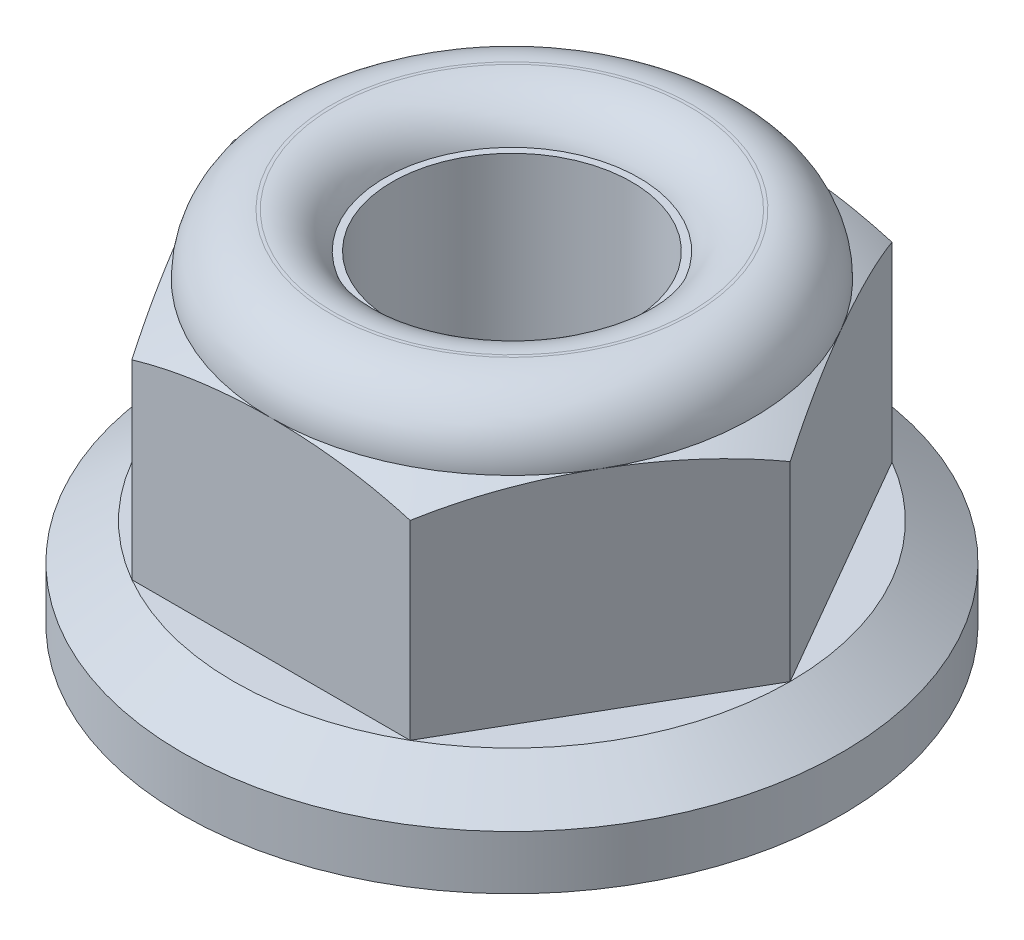
ISO-10303-21;
HEADER;
FILE_DESCRIPTION(('STEP AP214'),'2;1');
FILE_NAME('part.step','',(''),(''),'','','');
FILE_SCHEMA(('AUTOMOTIVE_DESIGN { 1 0 10303 214 1 1 1 1 }'));
ENDSEC;
DATA;
#1=APPLICATION_CONTEXT('core data for automotive mechanical design processes');
#2=APPLICATION_PROTOCOL_DEFINITION('international standard','automotive_design',2000,#1);
#3=PRODUCT_CONTEXT('',#1,'mechanical');
#4=PRODUCT('Part','Part','',(#3));
#5=PRODUCT_RELATED_PRODUCT_CATEGORY('part','',(#4));
#6=PRODUCT_DEFINITION_FORMATION('','',#4);
#7=PRODUCT_DEFINITION_CONTEXT('part definition',#1,'design');
#8=PRODUCT_DEFINITION('design','',#6,#7);
#9=PRODUCT_DEFINITION_SHAPE('','',#8);
#10=(LENGTH_UNIT() NAMED_UNIT(*) SI_UNIT(.MILLI.,.METRE.));
#11=(NAMED_UNIT(*) PLANE_ANGLE_UNIT() SI_UNIT($,.RADIAN.));
#12=(NAMED_UNIT(*) SI_UNIT($,.STERADIAN.) SOLID_ANGLE_UNIT());
#13=UNCERTAINTY_MEASURE_WITH_UNIT(LENGTH_MEASURE(1.E-05),#10,'distance_accuracy_value','');
#14=(GEOMETRIC_REPRESENTATION_CONTEXT(3) GLOBAL_UNCERTAINTY_ASSIGNED_CONTEXT((#13)) GLOBAL_UNIT_ASSIGNED_CONTEXT((#10,
#11,#12)) REPRESENTATION_CONTEXT('',''));
#15=CARTESIAN_POINT('',(0.,0.,0.));
#16=DIRECTION('',(0.,0.,1.));
#17=DIRECTION('',(1.,0.,0.));
#18=AXIS2_PLACEMENT_3D('',#15,#16,#17);
#19=CARTESIAN_POINT('',(0.,1.5,0.));
#20=DIRECTION('',(0.,1.,0.));
#21=DIRECTION('',(0.,0.,1.));
#22=AXIS2_PLACEMENT_3D('',#19,#20,#21);
#23=PLANE('',#22);
#24=DIRECTION('',(0.499999999999995,0.,-0.866025403784441));
#25=VECTOR('',#24,1.);
#26=CARTESIAN_POINT('',(2.32155559797741,1.5,4.02105224829271));
#27=LINE('',#26,#25);
#28=CARTESIAN_POINT('',(2.32155559797741,1.5,4.02105224829271));
#29=VERTEX_POINT('',#28);
#30=CARTESIAN_POINT('',(4.64311119595473,1.5,0.));
#31=VERTEX_POINT('',#30);
#32=EDGE_CURVE('E154',#29,#31,#27,.T.);
#33=ORIENTED_EDGE('',*,*,#32,.F.);
#34=CARTESIAN_POINT('',(0.,1.5,0.));
#35=DIRECTION('',(0.,1.,0.));
#36=DIRECTION('',(0.,0.,1.));
#37=AXIS2_PLACEMENT_3D('',#34,#35,#36);
#38=CIRCLE('',#37,4.64311119595473);
#39=EDGE_CURVE('E310',#29,#31,#38,.T.);
#40=ORIENTED_EDGE('',*,*,#39,.T.);
#41=EDGE_LOOP('',(#33,#40));
#42=FACE_BOUND('',#41,.T.);
#43=ADVANCED_FACE('F41',(#42),#23,.T.);
#44=DIRECTION('',(1.,0.,0.));
#45=VECTOR('',#44,1.);
#46=CARTESIAN_POINT('',(-2.32155559797733,1.5,4.02105224829276));
#47=LINE('',#46,#45);
#48=CARTESIAN_POINT('',(-2.32155559797733,1.5,4.02105224829276));
#49=VERTEX_POINT('',#48);
#50=EDGE_CURVE('E288',#49,#29,#47,.T.);
#51=ORIENTED_EDGE('',*,*,#50,.F.);
#52=EDGE_CURVE('E309',#49,#29,#38,.T.);
#53=ORIENTED_EDGE('',*,*,#52,.T.);
#54=EDGE_LOOP('',(#51,#53));
#55=FACE_BOUND('',#54,.T.);
#56=ADVANCED_FACE('F230',(#55),#23,.T.);
#57=DIRECTION('',(0.500000000000007,0.,0.866025403784435));
#58=VECTOR('',#57,1.);
#59=CARTESIAN_POINT('',(-4.64311119595473,1.5,0.));
#60=LINE('',#59,#58);
#61=CARTESIAN_POINT('',(-4.64311119595473,1.5,0.));
#62=VERTEX_POINT('',#61);
#63=EDGE_CURVE('E284',#62,#49,#60,.T.);
#64=ORIENTED_EDGE('',*,*,#63,.F.);
#65=EDGE_CURVE('E330',#62,#49,#38,.T.);
#66=ORIENTED_EDGE('',*,*,#65,.T.);
#67=EDGE_LOOP('',(#64,#66));
#68=FACE_BOUND('',#67,.T.);
#69=ADVANCED_FACE('F237',(#68),#23,.T.);
#70=DIRECTION('',(-0.499999999999995,0.,0.866025403784442));
#71=VECTOR('',#70,1.);
#72=CARTESIAN_POINT('',(-2.32155559797738,1.5,-4.02105224829273));
#73=LINE('',#72,#71);
#74=CARTESIAN_POINT('',(-2.32155559797738,1.5,-4.02105224829273));
#75=VERTEX_POINT('',#74);
#76=EDGE_CURVE('E269',#75,#62,#73,.T.);
#77=ORIENTED_EDGE('',*,*,#76,.F.);
#78=EDGE_CURVE('E332',#75,#62,#38,.T.);
#79=ORIENTED_EDGE('',*,*,#78,.T.);
#80=EDGE_LOOP('',(#77,#79));
#81=FACE_BOUND('',#80,.T.);
#82=ADVANCED_FACE('F256',(#81),#23,.T.);
#83=DIRECTION('',(-1.,0.,0.));
#84=VECTOR('',#83,1.);
#85=CARTESIAN_POINT('',(2.32155559797736,1.5,-4.02105224829275));
#86=LINE('',#85,#84);
#87=CARTESIAN_POINT('',(2.32155559797736,1.5,-4.02105224829275));
#88=VERTEX_POINT('',#87);
#89=EDGE_CURVE('E264',#88,#75,#86,.T.);
#90=ORIENTED_EDGE('',*,*,#89,.F.);
#91=EDGE_CURVE('E267',#88,#75,#38,.T.);
#92=ORIENTED_EDGE('',*,*,#91,.T.);
#93=EDGE_LOOP('',(#90,#92));
#94=FACE_BOUND('',#93,.T.);
#95=ADVANCED_FACE('F245',(#94),#23,.T.);
#96=CARTESIAN_POINT('',(0.,1.5,0.));
#97=DIRECTION('',(0.,-1.,0.));
#98=DIRECTION('',(0.,0.,-1.));
#99=AXIS2_PLACEMENT_3D('',#96,#97,#98);
#100=CYLINDRICAL_SURFACE('',#99,5.5);
#101=CARTESIAN_POINT('',(0.,0.899999999999997,0.));
#102=DIRECTION('',(0.,1.,0.));
#103=DIRECTION('',(0.,0.,1.));
#104=AXIS2_PLACEMENT_3D('',#101,#102,#103);
#105=CIRCLE('',#104,5.5);
#106=CARTESIAN_POINT('',(0.,0.899999999999997,5.5));
#107=VERTEX_POINT('',#106);
#108=EDGE_CURVE('E51',#107,#107,#105,.F.);
#109=ORIENTED_EDGE('',*,*,#108,.T.);
#110=EDGE_LOOP('',(#109));
#111=FACE_BOUND('',#110,.T.);
#112=CARTESIAN_POINT('',(0.,0.,0.));
#113=DIRECTION('',(0.,1.,0.));
#114=DIRECTION('',(0.,0.,1.));
#115=AXIS2_PLACEMENT_3D('',#112,#113,#114);
#116=CIRCLE('',#115,5.5);
#117=CARTESIAN_POINT('',(0.,0.,5.5));
#118=VERTEX_POINT('',#117);
#119=EDGE_CURVE('E305',#118,#118,#116,.T.);
#120=ORIENTED_EDGE('',*,*,#119,.T.);
#121=EDGE_LOOP('',(#120));
#122=FACE_BOUND('',#121,.T.);
#123=ADVANCED_FACE('F243',(#111,#122),#100,.T.);
#124=DIRECTION('',(-0.500000000000001,0.,-0.866025403784438));
#125=VECTOR('',#124,1.);
#126=CARTESIAN_POINT('',(4.64311119595473,1.5,0.));
#127=LINE('',#126,#125);
#128=EDGE_CURVE('E157',#31,#88,#127,.T.);
#129=ORIENTED_EDGE('',*,*,#128,.F.);
#130=EDGE_CURVE('E314',#31,#88,#38,.T.);
#131=ORIENTED_EDGE('',*,*,#130,.T.);
#132=EDGE_LOOP('',(#129,#131));
#133=FACE_BOUND('',#132,.T.);
#134=ADVANCED_FACE('F233',(#133),#23,.T.);
#135=CARTESIAN_POINT('',(0.,0.,0.));
#136=DIRECTION('',(0.,1.,0.));
#137=DIRECTION('',(0.,0.,1.));
#138=AXIS2_PLACEMENT_3D('',#135,#136,#137);
#139=PLANE('',#138);
#140=CARTESIAN_POINT('',(0.,0.,0.));
#141=DIRECTION('',(0.,1.,0.));
#142=DIRECTION('',(0.,0.,1.));
#143=AXIS2_PLACEMENT_3D('',#140,#141,#142);
#144=CIRCLE('',#143,2.);
#145=CARTESIAN_POINT('',(0.,0.,2.));
#146=VERTEX_POINT('',#145);
#147=EDGE_CURVE('E375',#146,#146,#144,.T.);
#148=ORIENTED_EDGE('',*,*,#147,.T.);
#149=EDGE_LOOP('',(#148));
#150=FACE_BOUND('',#149,.T.);
#151=ORIENTED_EDGE('',*,*,#119,.F.);
#152=EDGE_LOOP('',(#151));
#153=FACE_BOUND('',#152,.T.);
#154=ADVANCED_FACE('F242',(#150,#153),#139,.F.);
#155=CARTESIAN_POINT('',(0.,1.5,0.));
#156=DIRECTION('',(0.,-1.,0.));
#157=DIRECTION('',(0.,0.,-1.));
#158=AXIS2_PLACEMENT_3D('',#155,#156,#157);
#159=CONICAL_SURFACE('',#158,4.64311119595473,0.959931088596881);
#160=ORIENTED_EDGE('',*,*,#108,.F.);
#161=EDGE_LOOP('',(#160));
#162=FACE_BOUND('',#161,.T.);
#163=ORIENTED_EDGE('',*,*,#39,.F.);
#164=ORIENTED_EDGE('',*,*,#52,.F.);
#165=ORIENTED_EDGE('',*,*,#65,.F.);
#166=ORIENTED_EDGE('',*,*,#78,.F.);
#167=ORIENTED_EDGE('',*,*,#91,.F.);
#168=ORIENTED_EDGE('',*,*,#130,.F.);
#169=EDGE_LOOP('',(#163,#164,#165,#166,#167,#168));
#170=FACE_BOUND('',#169,.T.);
#171=ADVANCED_FACE('F250',(#162,#170),#159,.T.);
#172=CARTESIAN_POINT('',(2.32155559797741,5.,4.02105224829271));
#173=DIRECTION('',(-0.866025403784441,0.,-0.499999999999995));
#174=DIRECTION('',(-0.499999999999995,0.,0.866025403784442));
#175=AXIS2_PLACEMENT_3D('',#172,#173,#174);
#176=PLANE('',#175);
#177=DIRECTION('',(0.,-1.,0.));
#178=VECTOR('',#177,1.);
#179=CARTESIAN_POINT('',(4.64311119595473,5.,0.));
#180=LINE('',#179,#178);
#181=CARTESIAN_POINT('',(4.64311119594153,4.67908661968016,2.28647358120848E-11));
#182=VERTEX_POINT('',#181);
#183=EDGE_CURVE('E276',#182,#31,#180,.T.);
#184=ORIENTED_EDGE('',*,*,#183,.F.);
#185=CARTESIAN_POINT('',(4.64322666600857,4.6790184883887,-0.0002));
#186=CARTESIAN_POINT('',(4.54071917949174,4.73949251452338,0.177348174803329));
#187=CARTESIAN_POINT('',(4.43692175263319,4.79074061593738,0.357130591817245));
#188=CARTESIAN_POINT('',(4.22765773875299,4.8759125553234,0.719586496053555));
#189=CARTESIAN_POINT('',(4.12219283652897,4.90985285509736,0.902257065120857));
#190=CARTESIAN_POINT('',(3.91240969791152,4.96113335951711,1.26561211977754));
#191=CARTESIAN_POINT('',(3.80811027238886,4.97878978628818,1.44626402398305));
#192=CARTESIAN_POINT('',(3.59911651271135,4.99942589079987,1.80825183420933));
#193=CARTESIAN_POINT('',(3.49442206382298,5.00240091296633,1.98958793895442));
#194=CARTESIAN_POINT('',(3.30030949241052,4.99442047579395,2.32580077502864));
#195=CARTESIAN_POINT('',(3.21087010838088,4.98541595773325,2.48071433236565));
#196=CARTESIAN_POINT('',(3.03247101960875,4.95644886890957,2.78971061814296));
#197=CARTESIAN_POINT('',(2.94351111441542,4.93649130556302,2.94379369377433));
#198=CARTESIAN_POINT('',(2.76488470912722,4.88459340553708,3.25318370330689));
#199=CARTESIAN_POINT('',(2.67523258919098,4.85245183791246,3.40846573004272));
#200=CARTESIAN_POINT('',(2.49721570619962,4.77545954599915,3.7168000159888));
#201=CARTESIAN_POINT('',(2.40885230998724,4.73059623238281,3.86984990775798));
#202=CARTESIAN_POINT('',(2.32144012792357,4.6790184883887,4.02125224829271));
#203=B_SPLINE_CURVE_WITH_KNOTS('',3,(#185,#186,#187,#188,#189,#190,#191,#192,#193,#194,#195,
#196,#197,#198,#199,#200,#201,#202),.UNSPECIFIED.,.F.,.F.,(4,2,2,2,2,2,2,2,4),(0.,
0.640834146736405,1.28105764092104,1.9085691947219,2.53627972396204,3.07328099560317,
3.61003697000898,4.15607416771669,4.70265361612622),.UNSPECIFIED.);
#204=CARTESIAN_POINT('',(3.48233339696607,5.,2.01052612414635));
#205=VERTEX_POINT('',#204);
#206=EDGE_CURVE('E349',#182,#205,#203,.T.);
#207=ORIENTED_EDGE('',*,*,#206,.T.);
#208=CARTESIAN_POINT('',(2.32155559798194,4.67908661967103,4.02105224829271));
#209=VERTEX_POINT('',#208);
#210=EDGE_CURVE('E202',#205,#209,#203,.T.);
#211=ORIENTED_EDGE('',*,*,#210,.T.);
#212=DIRECTION('',(0.,-1.,0.));
#213=VECTOR('',#212,1.);
#214=CARTESIAN_POINT('',(2.32155559797741,5.,4.02105224829271));
#215=LINE('',#214,#213);
#216=EDGE_CURVE('E291',#209,#29,#215,.T.);
#217=ORIENTED_EDGE('',*,*,#216,.T.);
#218=ORIENTED_EDGE('',*,*,#32,.T.);
#219=EDGE_LOOP('',(#184,#207,#211,#217,#218));
#220=FACE_BOUND('',#219,.T.);
#221=ADVANCED_FACE('F322',(#220),#176,.F.);
#222=CARTESIAN_POINT('',(4.64311119595473,5.,0.));
#223=DIRECTION('',(-0.866025403784438,0.,0.500000000000001));
#224=DIRECTION('',(0.500000000000001,0.,0.866025403784438));
#225=AXIS2_PLACEMENT_3D('',#222,#223,#224);
#226=PLANE('',#225);
#227=DIRECTION('',(0.,-1.,0.));
#228=VECTOR('',#227,1.);
#229=CARTESIAN_POINT('',(2.32155559797736,5.,-4.02105224829275));
#230=LINE('',#229,#228);
#231=CARTESIAN_POINT('',(2.32155559799053,4.67908661968014,-4.02105224826994));
#232=VERTEX_POINT('',#231);
#233=EDGE_CURVE('E273',#232,#88,#230,.T.);
#234=ORIENTED_EDGE('',*,*,#233,.F.);
#235=CARTESIAN_POINT('',(2.32144012792352,4.6790184883887,-4.02125224829275));
#236=CARTESIAN_POINT('',(2.42394761444035,4.73949251452338,-3.84370407348942));
#237=CARTESIAN_POINT('',(2.52774504129889,4.79074061593738,-3.6639216564755));
#238=CARTESIAN_POINT('',(2.73700905517909,4.8759125553234,-3.30146575223919));
#239=CARTESIAN_POINT('',(2.84247395740312,4.90985285509736,-3.11879518317189));
#240=CARTESIAN_POINT('',(3.05225709602057,4.96113335951711,-2.75544012851521));
#241=CARTESIAN_POINT('',(3.15655652154324,4.97878978628818,-2.57478822430971));
#242=CARTESIAN_POINT('',(3.36555028122075,4.99942589079987,-2.21280041408342));
#243=CARTESIAN_POINT('',(3.47024473010912,5.00240091296634,-2.03146430933834));
#244=CARTESIAN_POINT('',(3.66435730152158,4.99442047579396,-1.69525147326411));
#245=CARTESIAN_POINT('',(3.75379668555123,4.98541595773326,-1.5403379159271));
#246=CARTESIAN_POINT('',(3.93219577432336,4.95644886890958,-1.23134163014978));
#247=CARTESIAN_POINT('',(4.0211556795167,4.93649130556302,-1.0772585545184));
#248=CARTESIAN_POINT('',(4.19978208480491,4.88459340553708,-0.767868544985839));
#249=CARTESIAN_POINT('',(4.28943420474115,4.85245183791246,-0.612586518250011));
#250=CARTESIAN_POINT('',(4.46745108773252,4.77545954599915,-0.304252232303916));
#251=CARTESIAN_POINT('',(4.5558144839449,4.73059623238281,-0.151202340534734));
#252=CARTESIAN_POINT('',(4.64322666600857,4.6790184883887,0.000200000000000039));
#253=B_SPLINE_CURVE_WITH_KNOTS('',3,(#235,#236,#237,#238,#239,#240,#241,#242,#243,#244,#245,
#246,#247,#248,#249,#250,#251,#252),.UNSPECIFIED.,.F.,.F.,(4,2,2,2,2,2,2,2,4),(0.,
0.640834146736405,1.28105764092104,1.9085691947219,2.53627972396204,3.07328099560319,
3.61003697000901,4.15607416771673,4.70265361612628),.UNSPECIFIED.);
#254=CARTESIAN_POINT('',(3.48233339696605,5.,-2.01052612414638));
#255=VERTEX_POINT('',#254);
#256=EDGE_CURVE('E122',#232,#255,#253,.T.);
#257=ORIENTED_EDGE('',*,*,#256,.T.);
#258=EDGE_CURVE('E166',#255,#182,#253,.T.);
#259=ORIENTED_EDGE('',*,*,#258,.T.);
#260=ORIENTED_EDGE('',*,*,#183,.T.);
#261=ORIENTED_EDGE('',*,*,#128,.T.);
#262=EDGE_LOOP('',(#234,#257,#259,#260,#261));
#263=FACE_BOUND('',#262,.T.);
#264=ADVANCED_FACE('F272',(#263),#226,.F.);
#265=CARTESIAN_POINT('',(2.32155559797736,5.,-4.02105224829275));
#266=DIRECTION('',(0.,0.,1.));
#267=DIRECTION('',(1.,0.,0.));
#268=AXIS2_PLACEMENT_3D('',#265,#266,#267);
#269=PLANE('',#268);
#270=DIRECTION('',(0.,-1.,0.));
#271=VECTOR('',#270,1.);
#272=CARTESIAN_POINT('',(-2.32155559797738,5.,-4.02105224829273));
#273=LINE('',#272,#271);
#274=CARTESIAN_POINT('',(-2.32155559797738,4.67908661967237,-4.02105224829273));
#275=VERTEX_POINT('',#274);
#276=EDGE_CURVE('E152',#275,#75,#273,.T.);
#277=ORIENTED_EDGE('',*,*,#276,.F.);
#278=CARTESIAN_POINT('',(-6.25430221987615,-2.34719295837058,-4.02105224829272));
#279=CARTESIAN_POINT('',(-6.30245547265336,-2.20704155658153,-4.02105224829272));
#280=CARTESIAN_POINT('',(-6.34470122282935,-2.06485959144371,-4.02105224829272));
#281=CARTESIAN_POINT('',(-6.41710676327432,-1.77745293203967,-4.02105224829272));
#282=CARTESIAN_POINT('',(-6.44726669978081,-1.63222827461218,-4.02105224829272));
#283=CARTESIAN_POINT('',(-6.49521139523164,-1.33986973744271,-4.02105224829272));
#284=CARTESIAN_POINT('',(-6.51300616645612,-1.19273750087489,-4.02105224829272));
#285=CARTESIAN_POINT('',(-6.53611801281192,-0.8975001637455,-4.02105224829272));
#286=CARTESIAN_POINT('',(-6.54143541067294,-0.749395088445953,-4.02105224829272));
#287=CARTESIAN_POINT('',(-6.53954695023309,-0.453195524771181,-4.02105224829272));
#288=CARTESIAN_POINT('',(-6.53233529562642,-0.305101073010273,-4.02105224829272));
#289=CARTESIAN_POINT('',(-6.50543453863608,-0.00999734015355483,-4.02105224829272));
#290=CARTESIAN_POINT('',(-6.48574081922057,0.137011519024365,-4.02105224829272));
#291=CARTESIAN_POINT('',(-6.43404539957989,0.428759020711517,-4.02105224829272));
#292=CARTESIAN_POINT('',(-6.40205170205445,0.57349907577117,-4.02105224829272));
#293=CARTESIAN_POINT('',(-6.32602939727243,0.859803018011067,-4.02105224829272));
#294=CARTESIAN_POINT('',(-6.28199628607366,1.0013656950459,-4.02105224829272));
#295=CARTESIAN_POINT('',(-6.13235626431292,1.41969720038692,-4.02105224829272));
#296=CARTESIAN_POINT('',(-6.00915934035537,1.69038527184056,-4.02105224829272));
#297=CARTESIAN_POINT('',(-5.71984722314714,2.20778059483155,-4.02105224829272));
#298=CARTESIAN_POINT('',(-5.55372020412823,2.45448121283692,-4.02105224829272));
#299=CARTESIAN_POINT('',(-5.27466608857882,2.80425920436429,-4.02105224829272));
#300=CARTESIAN_POINT('',(-5.17547568236238,2.91855291753672,-4.02105224829272));
#301=CARTESIAN_POINT('',(-4.96815262222787,3.13869798204072,-4.02105224829272));
#302=CARTESIAN_POINT('',(-4.86002268536009,3.24455187946624,-4.02105224829272));
#303=CARTESIAN_POINT('',(-4.63566878631999,3.44728937779899,-4.02105224829272));
#304=CARTESIAN_POINT('',(-4.5194444742425,3.54417259049753,-4.02105224829272));
#305=CARTESIAN_POINT('',(-4.27982752443776,3.72854954226192,-4.02105224829272));
#306=CARTESIAN_POINT('',(-4.1564366948663,3.81604563402904,-4.02105224829273));
#307=CARTESIAN_POINT('',(-3.89643615635653,3.98594375011292,-4.02105224829273));
#308=CARTESIAN_POINT('',(-3.75947259787334,4.06780398866317,-4.02105224829273));
#309=CARTESIAN_POINT('',(-3.47963325542793,4.2206756695829,-4.02105224829273));
#310=CARTESIAN_POINT('',(-3.33675738778573,4.29168695833476,-4.02105224829273));
#311=CARTESIAN_POINT('',(-3.04607583613892,4.42293363410886,-4.02105224829273));
#312=CARTESIAN_POINT('',(-2.89826804538813,4.48316434427955,-4.02105224829273));
#313=CARTESIAN_POINT('',(-2.5987594322032,4.5930360884021,-4.02105224829273));
#314=CARTESIAN_POINT('',(-2.44705784281827,4.64267501790796,-4.02105224829273));
#315=CARTESIAN_POINT('',(-2.0740805311389,4.75106647843025,-4.02105224829273));
#316=CARTESIAN_POINT('',(-1.85121967955942,4.8044047634821,-4.02105224829273));
#317=CARTESIAN_POINT('',(-1.40166893025367,4.89141469716107,-4.02105224829273));
#318=CARTESIAN_POINT('',(-1.17497732928725,4.92507734748334,-4.02105224829273));
#319=CARTESIAN_POINT('',(-0.718912944235667,4.97420802865402,-4.02105224829274));
#320=CARTESIAN_POINT('',(-0.489533833721932,4.98961646437595,-4.02105224829274));
#321=CARTESIAN_POINT('',(-0.030298292008584,5.00288323903094,-4.02105224829274));
#322=CARTESIAN_POINT('',(0.19955810608355,5.00074275711204,-4.02105224829274));
#323=CARTESIAN_POINT('',(0.663404829902746,4.97855340202646,-4.02105224829274));
#324=CARTESIAN_POINT('',(0.897377191953674,4.95811866105356,-4.02105224829274));
#325=CARTESIAN_POINT('',(1.36284118712317,4.89768698590859,-4.02105224829274));
#326=CARTESIAN_POINT('',(1.59433271065715,4.85768919119956,-4.02105224829274));
#327=CARTESIAN_POINT('',(2.05180098933632,4.75674661030177,-4.02105224829275));
#328=CARTESIAN_POINT('',(2.27779589431396,4.69588506391656,-4.02105224829275));
#329=CARTESIAN_POINT('',(2.72251603775936,4.55177116211142,-4.02105224829275));
#330=CARTESIAN_POINT('',(2.94124476590578,4.46852973484491,-4.02105224829275));
#331=CARTESIAN_POINT('',(3.30622691822741,4.3064688906978,-4.02105224829275));
#332=CARTESIAN_POINT('',(3.45505444988456,4.23340684793705,-4.02105224829275));
#333=CARTESIAN_POINT('',(3.74635960818206,4.07557829720684,-4.02105224829275));
#334=CARTESIAN_POINT('',(3.88883854527595,3.99081421967164,-4.02105224829275));
#335=CARTESIAN_POINT('',(4.16630750518162,3.80968819209992,-4.02105224829275));
#336=CARTESIAN_POINT('',(4.30129482648657,3.71332209752251,-4.02105224829275));
#337=CARTESIAN_POINT('',(4.56252877725095,3.50936690290154,-4.02105224829275));
#338=CARTESIAN_POINT('',(4.68877511167118,3.40177742433607,-4.02105224829275));
#339=CARTESIAN_POINT('',(4.93183306032764,3.17547828912521,-4.02105224829276));
#340=CARTESIAN_POINT('',(5.04860491516524,3.05672587263284,-4.02105224829276));
#341=CARTESIAN_POINT('',(5.27101538315317,2.80921705032763,-4.02105224829276));
#342=CARTESIAN_POINT('',(5.3766545312482,2.68046112571661,-4.02105224829276));
#343=CARTESIAN_POINT('',(5.57574732428403,2.41387126702158,-4.02105224829276));
#344=CARTESIAN_POINT('',(5.66920265584423,2.27603859342663,-4.02105224829276));
#345=CARTESIAN_POINT('',(5.84300062613316,1.992342795817,-4.02105224829276));
#346=CARTESIAN_POINT('',(5.92334415859976,1.84648022005064,-4.02105224829276));
#347=CARTESIAN_POINT('',(6.06481129602139,1.55868092493949,-4.02105224829276));
#348=CARTESIAN_POINT('',(6.12690287806739,1.41721913362373,-4.02105224829276));
#349=CARTESIAN_POINT('',(6.23854737757475,1.12943331091197,-4.02105224829276));
#350=CARTESIAN_POINT('',(6.28810091631996,0.983109520843891,-4.02105224829276));
#351=CARTESIAN_POINT('',(6.37423348248312,0.686674638363847,-4.02105224829276));
#352=CARTESIAN_POINT('',(6.41081113719636,0.536563147053249,-4.02105224829276));
#353=CARTESIAN_POINT('',(6.47065588028149,0.233714065566043,-4.02105224829276));
#354=CARTESIAN_POINT('',(6.4939235779564,0.0809765959312039,-4.02105224829276));
#355=CARTESIAN_POINT('',(6.52637907439253,-0.220717307615619,-4.02105224829276));
#356=CARTESIAN_POINT('',(6.53601965316045,-0.369625223408446,-4.02105224829276));
#357=CARTESIAN_POINT('',(6.54260898473833,-0.667717964298946,-4.02105224829276));
#358=CARTESIAN_POINT('',(6.53955828041165,-0.816902777279637,-4.02105224829276));
#359=CARTESIAN_POINT('',(6.52080575666483,-1.11426787367842,-4.02105224829276));
#360=CARTESIAN_POINT('',(6.50512101355286,-1.26244924092956,-4.02105224829276));
#361=CARTESIAN_POINT('',(6.46125868987567,-1.55689112632194,-4.02105224829276));
#362=CARTESIAN_POINT('',(6.43308737432597,-1.70315256992197,-4.02105224829276));
#363=CARTESIAN_POINT('',(6.37880952486651,-1.93233643417707,-4.02105224829276));
#364=CARTESIAN_POINT('',(6.35674132027026,-2.01623616134875,-4.02105224829276));
#365=CARTESIAN_POINT('',(6.30854847412748,-2.18271366270411,-4.02105224829276));
#366=CARTESIAN_POINT('',(6.28243052916771,-2.26529337534761,-4.02105224829276));
#367=CARTESIAN_POINT('',(6.25430221987613,-2.34719295837056,-4.02105224829276));
#368=B_SPLINE_CURVE_WITH_KNOTS('',3,(#278,#279,#280,#281,#282,#283,#284,#285,#286,#287,#288,
#289,#290,#291,#292,#293,#294,#295,#296,#297,#298,#299,#300,#301,#302,#303,#304,#305,#306,#307,
#308,#309,#310,#311,#312,#313,#314,#315,#316,#317,#318,#319,#320,#321,#322,#323,#324,#325,#326,
#327,#328,#329,#330,#331,#332,#333,#334,#335,#336,#337,#338,#339,#340,#341,#342,#343,#344,#345,
#346,#347,#348,#349,#350,#351,#352,#353,#354,#355,#356,#357,#358,#359,#360,#361,#362,#363,#364,
#365,#366,#367),.UNSPECIFIED.,.F.,.F.,(4,2,2,2,2,2,2,2,2,2,2,2,2,2,2,2,2,2,2,2,2,2,2,2,2,2,2,2,
2,2,2,2,2,2,2,2,2,2,2,2,2,2,2,2,4),(0.,0.444450303325536,0.88889522867063,1.33297985889003,
1.77705300264739,2.2213316423287,2.66577471367555,3.10992910633302,3.5542498849399,
4.44206160223436,5.33011814237667,5.78369574044029,6.23713598295661,6.6905958390537,
7.1439417773469,7.62212726319894,8.10031951937498,8.57871872567502,9.05721289521072,
9.743651592182,10.4304039746594,11.1193922949588,11.8083343210891,12.512159243585,
13.2160151286212,13.9170949167335,14.6178329855998,15.1147325052622,15.6115289770506,
16.1085034469284,16.6054946832811,17.104473912013,17.6034291530374,18.10231524962,
18.6011673264786,19.0640600776706,19.5269298871539,19.9898486485401,20.4527462167414,
20.8998696720245,21.3469740020193,21.7934750327939,22.2397522891969,22.4999181573936,
22.7596583192141),.UNSPECIFIED.);
#369=CARTESIAN_POINT('',(0.,5.,-4.02105224829275));
#370=VERTEX_POINT('',#369);
#371=EDGE_CURVE('E127',#275,#370,#368,.T.);
#372=ORIENTED_EDGE('',*,*,#371,.T.);
#373=EDGE_CURVE('E116',#370,#232,#368,.T.);
#374=ORIENTED_EDGE('',*,*,#373,.T.);
#375=ORIENTED_EDGE('',*,*,#233,.T.);
#376=ORIENTED_EDGE('',*,*,#89,.T.);
#377=EDGE_LOOP('',(#277,#372,#374,#375,#376));
#378=FACE_BOUND('',#377,.T.);
#379=ADVANCED_FACE('F150',(#378),#269,.F.);
#380=CARTESIAN_POINT('',(-2.32155559797738,5.,-4.02105224829273));
#381=DIRECTION('',(0.866025403784442,0.,0.499999999999995));
#382=DIRECTION('',(0.499999999999995,0.,-0.866025403784442));
#383=AXIS2_PLACEMENT_3D('',#380,#381,#382);
#384=PLANE('',#383);
#385=DIRECTION('',(0.,-1.,0.));
#386=VECTOR('',#385,1.);
#387=CARTESIAN_POINT('',(-4.64311119595473,5.,0.));
#388=LINE('',#387,#386);
#389=CARTESIAN_POINT('',(-4.64311119595473,4.67908661967237,0.));
#390=VERTEX_POINT('',#389);
#391=EDGE_CURVE('E296',#390,#62,#388,.T.);
#392=ORIENTED_EDGE('',*,*,#391,.F.);
#393=CARTESIAN_POINT('',(-4.64322666600857,4.6790184883887,0.000200000000032423));
#394=CARTESIAN_POINT('',(-4.54071917949174,4.73949251452338,-0.177348174803296));
#395=CARTESIAN_POINT('',(-4.43692175263319,4.79074061593738,-0.357130591817212));
#396=CARTESIAN_POINT('',(-4.22765773875299,4.8759125553234,-0.719586496053521));
#397=CARTESIAN_POINT('',(-4.12219283652897,4.90985285509736,-0.902257065120824));
#398=CARTESIAN_POINT('',(-3.91240969791152,4.96113335951711,-1.26561211977751));
#399=CARTESIAN_POINT('',(-3.80811027238886,4.97878978628818,-1.44626402398301));
#400=CARTESIAN_POINT('',(-3.59911651271135,4.99942589079987,-1.8082518342093));
#401=CARTESIAN_POINT('',(-3.49442206382298,5.00240091296634,-1.98958793895438));
#402=CARTESIAN_POINT('',(-3.30030949241052,4.99442047579396,-2.32580077502861));
#403=CARTESIAN_POINT('',(-3.21087010838087,4.98541595773326,-2.48071433236562));
#404=CARTESIAN_POINT('',(-3.03247101960875,4.95644886890958,-2.78971061814294));
#405=CARTESIAN_POINT('',(-2.94351111441541,4.93649130556302,-2.94379369377432));
#406=CARTESIAN_POINT('',(-2.7648847091272,4.88459340553708,-3.25318370330689));
#407=CARTESIAN_POINT('',(-2.67523258919096,4.85245183791247,-3.40846573004272));
#408=CARTESIAN_POINT('',(-2.49721570619959,4.77545954599915,-3.71680001598881));
#409=CARTESIAN_POINT('',(-2.40885230998721,4.73059623238281,-3.86984990775799));
#410=CARTESIAN_POINT('',(-2.32144012792355,4.6790184883887,-4.02125224829273));
#411=B_SPLINE_CURVE_WITH_KNOTS('',3,(#393,#394,#395,#396,#397,#398,#399,#400,#401,#402,#403,
#404,#405,#406,#407,#408,#409,#410),.UNSPECIFIED.,.F.,.F.,(4,2,2,2,2,2,2,2,4),(0.,
0.640834146736405,1.28105764092104,1.9085691947219,2.53627972396203,3.07328099560319,
3.61003697000901,4.15607416771673,4.70265361612628),.UNSPECIFIED.);
#412=CARTESIAN_POINT('',(-3.48233339696607,5.,-2.01052612414635));
#413=VERTEX_POINT('',#412);
#414=EDGE_CURVE('E208',#390,#413,#411,.T.);
#415=ORIENTED_EDGE('',*,*,#414,.T.);
#416=EDGE_CURVE('E128',#413,#275,#411,.T.);
#417=ORIENTED_EDGE('',*,*,#416,.T.);
#418=ORIENTED_EDGE('',*,*,#276,.T.);
#419=ORIENTED_EDGE('',*,*,#76,.T.);
#420=EDGE_LOOP('',(#392,#415,#417,#418,#419));
#421=FACE_BOUND('',#420,.T.);
#422=ADVANCED_FACE('F216',(#421),#384,.F.);
#423=CARTESIAN_POINT('',(-4.64311119595473,5.,0.));
#424=DIRECTION('',(0.866025403784435,0.,-0.500000000000007));
#425=DIRECTION('',(-0.500000000000007,0.,-0.866025403784435));
#426=AXIS2_PLACEMENT_3D('',#423,#424,#425);
#427=PLANE('',#426);
#428=DIRECTION('',(0.,-1.,0.));
#429=VECTOR('',#428,1.);
#430=CARTESIAN_POINT('',(-2.32155559797733,5.,4.02105224829276));
#431=LINE('',#430,#429);
#432=CARTESIAN_POINT('',(-2.32155559797733,4.67908661967237,4.02105224829276));
#433=VERTEX_POINT('',#432);
#434=EDGE_CURVE('E65',#433,#49,#431,.T.);
#435=ORIENTED_EDGE('',*,*,#434,.F.);
#436=CARTESIAN_POINT('',(-2.32144012792349,4.6790184883887,4.02125224829276));
#437=CARTESIAN_POINT('',(-2.42394761444032,4.73949251452338,3.84370407348944));
#438=CARTESIAN_POINT('',(-2.52774504129887,4.79074061593738,3.66392165647552));
#439=CARTESIAN_POINT('',(-2.73700905517907,4.8759125553234,3.30146575223921));
#440=CARTESIAN_POINT('',(-2.8424739574031,4.90985285509736,3.11879518317191));
#441=CARTESIAN_POINT('',(-3.05225709602055,4.96113335951711,2.75544012851523));
#442=CARTESIAN_POINT('',(-3.15655652154322,4.97878978628818,2.57478822430973));
#443=CARTESIAN_POINT('',(-3.36555028122073,4.99942589079987,2.21280041408344));
#444=CARTESIAN_POINT('',(-3.4702447301091,5.00240091296634,2.03146430933836));
#445=CARTESIAN_POINT('',(-3.66435730152157,4.99442047579396,1.69525147326413));
#446=CARTESIAN_POINT('',(-3.75379668555122,4.98541595773326,1.54033791592713));
#447=CARTESIAN_POINT('',(-3.93219577432335,4.95644886890958,1.23134163014981));
#448=CARTESIAN_POINT('',(-4.02115567951669,4.93649130556302,1.07725855451843));
#449=CARTESIAN_POINT('',(-4.1997820848049,4.88459340553708,0.767868544985869));
#450=CARTESIAN_POINT('',(-4.28943420474114,4.85245183791247,0.612586518250041));
#451=CARTESIAN_POINT('',(-4.46745108773251,4.77545954599915,0.304252232303947));
#452=CARTESIAN_POINT('',(-4.5558144839449,4.73059623238281,0.151202340534767));
#453=CARTESIAN_POINT('',(-4.64322666600857,4.6790184883887,-0.000199999999967684));
#454=B_SPLINE_CURVE_WITH_KNOTS('',3,(#436,#437,#438,#439,#440,#441,#442,#443,#444,#445,#446,
#447,#448,#449,#450,#451,#452,#453),.UNSPECIFIED.,.F.,.F.,(4,2,2,2,2,2,2,2,4),(0.,
0.640834146736405,1.28105764092104,1.9085691947219,2.53627972396204,3.07328099560319,
3.61003697000901,4.15607416771673,4.70265361612628),.UNSPECIFIED.);
#455=CARTESIAN_POINT('',(-3.48233339696604,5.,2.0105261241464));
#456=VERTEX_POINT('',#455);
#457=EDGE_CURVE('E58',#433,#456,#454,.T.);
#458=ORIENTED_EDGE('',*,*,#457,.T.);
#459=EDGE_CURVE('E215',#456,#390,#454,.T.);
#460=ORIENTED_EDGE('',*,*,#459,.T.);
#461=ORIENTED_EDGE('',*,*,#391,.T.);
#462=ORIENTED_EDGE('',*,*,#63,.T.);
#463=EDGE_LOOP('',(#435,#458,#460,#461,#462));
#464=FACE_BOUND('',#463,.T.);
#465=ADVANCED_FACE('F219',(#464),#427,.F.);
#466=CARTESIAN_POINT('',(-2.32155559797733,5.,4.02105224829276));
#467=DIRECTION('',(0.,0.,-1.));
#468=DIRECTION('',(-1.,0.,0.));
#469=AXIS2_PLACEMENT_3D('',#466,#467,#468);
#470=PLANE('',#469);
#471=ORIENTED_EDGE('',*,*,#216,.F.);
#472=CARTESIAN_POINT('',(6.25430221987617,-2.34719295837058,4.02105224829267));
#473=CARTESIAN_POINT('',(6.30245547265338,-2.20704155658153,4.02105224829267));
#474=CARTESIAN_POINT('',(6.34470122282938,-2.06485959144371,4.02105224829267));
#475=CARTESIAN_POINT('',(6.41710676327435,-1.77745293203967,4.02105224829267));
#476=CARTESIAN_POINT('',(6.44726669978084,-1.63222827461218,4.02105224829267));
#477=CARTESIAN_POINT('',(6.49521139523167,-1.33986973744271,4.02105224829267));
#478=CARTESIAN_POINT('',(6.51300616645615,-1.1927375008749,4.02105224829267));
#479=CARTESIAN_POINT('',(6.53611801281195,-0.8975001637455,4.02105224829267));
#480=CARTESIAN_POINT('',(6.54143541067296,-0.749395088445953,4.02105224829267));
#481=CARTESIAN_POINT('',(6.53954695023312,-0.453195524771181,4.02105224829267));
#482=CARTESIAN_POINT('',(6.53233529562645,-0.305101073010273,4.02105224829267));
#483=CARTESIAN_POINT('',(6.50543453863611,-0.00999734015355493,4.02105224829267));
#484=CARTESIAN_POINT('',(6.48574081922059,0.137011519024364,4.02105224829267));
#485=CARTESIAN_POINT('',(6.43404539957992,0.428759020711517,4.02105224829267));
#486=CARTESIAN_POINT('',(6.40205170205448,0.57349907577117,4.02105224829267));
#487=CARTESIAN_POINT('',(6.32602939727246,0.859803018011067,4.02105224829267));
#488=CARTESIAN_POINT('',(6.28199628607369,1.0013656950459,4.02105224829267));
#489=CARTESIAN_POINT('',(6.13235626431295,1.41969720038692,4.02105224829267));
#490=CARTESIAN_POINT('',(6.0091593403554,1.69038527184056,4.02105224829268));
#491=CARTESIAN_POINT('',(5.71984722314717,2.20778059483155,4.02105224829268));
#492=CARTESIAN_POINT('',(5.55372020412826,2.45448121283692,4.02105224829268));
#493=CARTESIAN_POINT('',(5.27466608857885,2.80425920436429,4.02105224829268));
#494=CARTESIAN_POINT('',(5.17547568236241,2.91855291753672,4.02105224829269));
#495=CARTESIAN_POINT('',(4.9681526222279,3.13869798204072,4.02105224829269));
#496=CARTESIAN_POINT('',(4.86002268536012,3.24455187946624,4.02105224829269));
#497=CARTESIAN_POINT('',(4.63566878632002,3.44728937779899,4.02105224829269));
#498=CARTESIAN_POINT('',(4.51944447424253,3.54417259049753,4.02105224829269));
#499=CARTESIAN_POINT('',(4.27982752443779,3.72854954226192,4.02105224829269));
#500=CARTESIAN_POINT('',(4.15643669486634,3.81604563402905,4.02105224829269));
#501=CARTESIAN_POINT('',(3.89643615635656,3.98594375011292,4.0210522482927));
#502=CARTESIAN_POINT('',(3.75947259787337,4.06780398866317,4.0210522482927));
#503=CARTESIAN_POINT('',(3.47963325542796,4.22067566958289,4.0210522482927));
#504=CARTESIAN_POINT('',(3.33675738778576,4.29168695833476,4.0210522482927));
#505=CARTESIAN_POINT('',(3.04607583613895,4.42293363410885,4.02105224829271));
#506=CARTESIAN_POINT('',(2.89826804538816,4.48316434427955,4.02105224829271));
#507=CARTESIAN_POINT('',(2.59875943220323,4.5930360884021,4.02105224829271));
#508=CARTESIAN_POINT('',(2.4470578428183,4.64267501790796,4.02105224829271));
#509=CARTESIAN_POINT('',(2.07408053113893,4.75106647843025,4.02105224829272));
#510=CARTESIAN_POINT('',(1.85121967955945,4.8044047634821,4.02105224829272));
#511=CARTESIAN_POINT('',(1.4016689302537,4.89141469716107,4.02105224829272));
#512=CARTESIAN_POINT('',(1.17497732928728,4.92507734748334,4.02105224829273));
#513=CARTESIAN_POINT('',(0.718912944235697,4.97420802865402,4.02105224829273));
#514=CARTESIAN_POINT('',(0.489533833721962,4.98961646437594,4.02105224829273));
#515=CARTESIAN_POINT('',(0.0302982920086147,5.00288323903094,4.02105224829274));
#516=CARTESIAN_POINT('',(-0.19955810608352,5.00074275711204,4.02105224829274));
#517=CARTESIAN_POINT('',(-0.663404829902716,4.97855340202646,4.02105224829275));
#518=CARTESIAN_POINT('',(-0.897377191953644,4.95811866105356,4.02105224829275));
#519=CARTESIAN_POINT('',(-1.36284118712314,4.89768698590859,4.02105224829275));
#520=CARTESIAN_POINT('',(-1.59433271065712,4.85768919119956,4.02105224829276));
#521=CARTESIAN_POINT('',(-2.05180098933629,4.75674661030177,4.02105224829276));
#522=CARTESIAN_POINT('',(-2.27779589431393,4.69588506391657,4.02105224829276));
#523=CARTESIAN_POINT('',(-2.72251603775933,4.55177116211142,4.02105224829277));
#524=CARTESIAN_POINT('',(-2.94124476590575,4.46852973484491,4.02105224829277));
#525=CARTESIAN_POINT('',(-3.30622691822738,4.3064688906978,4.02105224829277));
#526=CARTESIAN_POINT('',(-3.45505444988453,4.23340684793705,4.02105224829277));
#527=CARTESIAN_POINT('',(-3.74635960818203,4.07557829720685,4.02105224829278));
#528=CARTESIAN_POINT('',(-3.88883854527592,3.99081421967164,4.02105224829278));
#529=CARTESIAN_POINT('',(-4.16630750518159,3.80968819209993,4.02105224829278));
#530=CARTESIAN_POINT('',(-4.30129482648654,3.71332209752251,4.02105224829278));
#531=CARTESIAN_POINT('',(-4.56252877725092,3.50936690290154,4.02105224829279));
#532=CARTESIAN_POINT('',(-4.68877511167115,3.40177742433607,4.02105224829279));
#533=CARTESIAN_POINT('',(-4.93183306032761,3.17547828912521,4.02105224829279));
#534=CARTESIAN_POINT('',(-5.04860491516521,3.05672587263284,4.02105224829279));
#535=CARTESIAN_POINT('',(-5.27101538315314,2.80921705032763,4.02105224829279));
#536=CARTESIAN_POINT('',(-5.37665453124817,2.68046112571661,4.0210522482928));
#537=CARTESIAN_POINT('',(-5.575747324284,2.41387126702158,4.0210522482928));
#538=CARTESIAN_POINT('',(-5.6692026558442,2.27603859342663,4.0210522482928));
#539=CARTESIAN_POINT('',(-5.84300062613313,1.99234279581701,4.0210522482928));
#540=CARTESIAN_POINT('',(-5.92334415859973,1.84648022005064,4.0210522482928));
#541=CARTESIAN_POINT('',(-6.06481129602136,1.55868092493949,4.0210522482928));
#542=CARTESIAN_POINT('',(-6.12690287806736,1.41721913362373,4.0210522482928));
#543=CARTESIAN_POINT('',(-6.23854737757472,1.12943331091197,4.0210522482928));
#544=CARTESIAN_POINT('',(-6.28810091631993,0.983109520843892,4.0210522482928));
#545=CARTESIAN_POINT('',(-6.37423348248309,0.686674638363849,4.0210522482928));
#546=CARTESIAN_POINT('',(-6.41081113719633,0.536563147053251,4.02105224829281));
#547=CARTESIAN_POINT('',(-6.47065588028146,0.233714065566046,4.02105224829281));
#548=CARTESIAN_POINT('',(-6.49392357795637,0.080976595931207,4.02105224829281));
#549=CARTESIAN_POINT('',(-6.5263790743925,-0.220717307615617,4.02105224829281));
#550=CARTESIAN_POINT('',(-6.53601965316042,-0.369625223408445,4.02105224829281));
#551=CARTESIAN_POINT('',(-6.5426089847383,-0.667717964298946,4.02105224829281));
#552=CARTESIAN_POINT('',(-6.53955828041163,-0.816902777279637,4.02105224829281));
#553=CARTESIAN_POINT('',(-6.5208057566648,-1.11426787367842,4.02105224829281));
#554=CARTESIAN_POINT('',(-6.50512101355283,-1.26244924092956,4.02105224829281));
#555=CARTESIAN_POINT('',(-6.46125868987564,-1.55689112632194,4.02105224829281));
#556=CARTESIAN_POINT('',(-6.43308737432594,-1.70315256992197,4.02105224829281));
#557=CARTESIAN_POINT('',(-6.37880952486648,-1.93233643417707,4.02105224829281));
#558=CARTESIAN_POINT('',(-6.35674132027023,-2.01623616134875,4.0210522482928));
#559=CARTESIAN_POINT('',(-6.30854847412745,-2.18271366270412,4.0210522482928));
#560=CARTESIAN_POINT('',(-6.28243052916768,-2.26529337534762,4.0210522482928));
#561=CARTESIAN_POINT('',(-6.25430221987609,-2.34719295837058,4.0210522482928));
#562=B_SPLINE_CURVE_WITH_KNOTS('',3,(#472,#473,#474,#475,#476,#477,#478,#479,#480,#481,#482,
#483,#484,#485,#486,#487,#488,#489,#490,#491,#492,#493,#494,#495,#496,#497,#498,#499,#500,#501,
#502,#503,#504,#505,#506,#507,#508,#509,#510,#511,#512,#513,#514,#515,#516,#517,#518,#519,#520,
#521,#522,#523,#524,#525,#526,#527,#528,#529,#530,#531,#532,#533,#534,#535,#536,#537,#538,#539,
#540,#541,#542,#543,#544,#545,#546,#547,#548,#549,#550,#551,#552,#553,#554,#555,#556,#557,#558,
#559,#560,#561),.UNSPECIFIED.,.F.,.F.,(4,2,2,2,2,2,2,2,2,2,2,2,2,2,2,2,2,2,2,2,2,2,2,2,2,2,2,2,
2,2,2,2,2,2,2,2,2,2,2,2,2,2,2,2,4),(0.,0.444450303325536,0.888895228670631,1.33297985889003,
1.77705300264739,2.2213316423287,2.66577471367555,3.10992910633302,3.5542498849399,
4.44206160223436,5.33011814237667,5.7836957404403,6.23713598295661,6.6905958390537,
7.1439417773469,7.62212726319894,8.10031951937498,8.57871872567503,9.05721289521073,
9.743651592182,10.4304039746594,11.1193922949588,11.8083343210891,12.512159243585,
13.2160151286212,13.9170949167335,14.6178329855998,15.1147325052622,15.6115289770506,
16.1085034469284,16.6054946832811,17.104473912013,17.6034291530374,18.10231524962,
18.6011673264786,19.0640600776706,19.5269298871539,19.9898486485401,20.4527462167414,
20.8998696720245,21.3469740020193,21.7934750327939,22.2397522891969,22.4999181573936,
22.7596583192141),.UNSPECIFIED.);
#563=CARTESIAN_POINT('',(0.,5.,4.02105224829275));
#564=VERTEX_POINT('',#563);
#565=EDGE_CURVE('E355',#209,#564,#562,.T.);
#566=ORIENTED_EDGE('',*,*,#565,.T.);
#567=EDGE_CURVE('E148',#564,#433,#562,.T.);
#568=ORIENTED_EDGE('',*,*,#567,.T.);
#569=ORIENTED_EDGE('',*,*,#434,.T.);
#570=ORIENTED_EDGE('',*,*,#50,.T.);
#571=EDGE_LOOP('',(#471,#566,#568,#569,#570));
#572=FACE_BOUND('',#571,.T.);
#573=ADVANCED_FACE('F180',(#572),#470,.F.);
#574=CARTESIAN_POINT('',(0.,-0.634839033503375,0.));
#575=DIRECTION('',(0.,-1.,0.));
#576=DIRECTION('',(0.,0.,-1.));
#577=AXIS2_PLACEMENT_3D('',#574,#575,#576);
#578=DEGENERATE_TOROIDAL_SURFACE('',#577,1.50790798487589,6.16987074599123,.T.);
#579=ORIENTED_EDGE('',*,*,#416,.F.);
#580=CARTESIAN_POINT('',(0.,5.,0.));
#581=DIRECTION('',(0.,-1.,0.));
#582=DIRECTION('',(0.,0.,-1.));
#583=AXIS2_PLACEMENT_3D('',#580,#581,#582);
#584=CIRCLE('',#583,4.02105224829275);
#585=EDGE_CURVE('E132',#413,#370,#584,.T.);
#586=ORIENTED_EDGE('',*,*,#585,.T.);
#587=ORIENTED_EDGE('',*,*,#371,.F.);
#588=EDGE_LOOP('',(#579,#586,#587));
#589=FACE_BOUND('',#588,.T.);
#590=ADVANCED_FACE('F133',(#589),#578,.T.);
#591=EDGE_CURVE('E120',#370,#255,#584,.T.);
#592=ORIENTED_EDGE('',*,*,#591,.T.);
#593=ORIENTED_EDGE('',*,*,#256,.F.);
#594=ORIENTED_EDGE('',*,*,#373,.F.);
#595=EDGE_LOOP('',(#592,#593,#594));
#596=FACE_BOUND('',#595,.T.);
#597=ADVANCED_FACE('F118',(#596),#578,.T.);
#598=EDGE_CURVE('E146',#255,#205,#584,.T.);
#599=ORIENTED_EDGE('',*,*,#598,.T.);
#600=ORIENTED_EDGE('',*,*,#206,.F.);
#601=ORIENTED_EDGE('',*,*,#258,.F.);
#602=EDGE_LOOP('',(#599,#600,#601));
#603=FACE_BOUND('',#602,.T.);
#604=ADVANCED_FACE('F414',(#603),#578,.T.);
#605=ORIENTED_EDGE('',*,*,#459,.F.);
#606=EDGE_CURVE('E139',#456,#413,#584,.T.);
#607=ORIENTED_EDGE('',*,*,#606,.T.);
#608=ORIENTED_EDGE('',*,*,#414,.F.);
#609=EDGE_LOOP('',(#605,#607,#608));
#610=FACE_BOUND('',#609,.T.);
#611=ADVANCED_FACE('F360',(#610),#578,.T.);
#612=EDGE_CURVE('E365',#205,#564,#584,.T.);
#613=ORIENTED_EDGE('',*,*,#612,.T.);
#614=ORIENTED_EDGE('',*,*,#565,.F.);
#615=ORIENTED_EDGE('',*,*,#210,.F.);
#616=EDGE_LOOP('',(#613,#614,#615));
#617=FACE_BOUND('',#616,.T.);
#618=ADVANCED_FACE('F407',(#617),#578,.T.);
#619=ORIENTED_EDGE('',*,*,#567,.F.);
#620=EDGE_CURVE('E362',#564,#456,#584,.T.);
#621=ORIENTED_EDGE('',*,*,#620,.T.);
#622=ORIENTED_EDGE('',*,*,#457,.F.);
#623=EDGE_LOOP('',(#619,#621,#622));
#624=FACE_BOUND('',#623,.T.);
#625=ADVANCED_FACE('F181',(#624),#578,.T.);
#626=CARTESIAN_POINT('',(0.,5.,0.));
#627=DIRECTION('',(0.,-1.,0.));
#628=DIRECTION('',(0.,0.,-1.));
#629=AXIS2_PLACEMENT_3D('',#626,#627,#628);
#630=TOROIDAL_SURFACE('',#629,3.02105224829275,1.);
#631=CARTESIAN_POINT('',(0.,6.,0.));
#632=DIRECTION('',(0.,-1.,0.));
#633=DIRECTION('',(0.,0.,-1.));
#634=AXIS2_PLACEMENT_3D('',#631,#632,#633);
#635=CIRCLE('',#634,3.02105224829275);
#636=CARTESIAN_POINT('',(0.,6.,-3.02105224829275));
#637=VERTEX_POINT('',#636);
#638=EDGE_CURVE('E140',#637,#637,#635,.T.);
#639=ORIENTED_EDGE('',*,*,#638,.T.);
#640=EDGE_LOOP('',(#639));
#641=FACE_BOUND('',#640,.T.);
#642=ORIENTED_EDGE('',*,*,#591,.F.);
#643=ORIENTED_EDGE('',*,*,#585,.F.);
#644=ORIENTED_EDGE('',*,*,#606,.F.);
#645=ORIENTED_EDGE('',*,*,#620,.F.);
#646=ORIENTED_EDGE('',*,*,#612,.F.);
#647=ORIENTED_EDGE('',*,*,#598,.F.);
#648=EDGE_LOOP('',(#642,#643,#644,#645,#646,#647));
#649=FACE_BOUND('',#648,.T.);
#650=ADVANCED_FACE('F143',(#641,#649),#630,.T.);
#651=CARTESIAN_POINT('',(0.,6.,0.));
#652=DIRECTION('',(0.,1.,0.));
#653=DIRECTION('',(0.,0.,1.));
#654=AXIS2_PLACEMENT_3D('',#651,#652,#653);
#655=PLANE('',#654);
#656=CARTESIAN_POINT('',(0.,6.,0.));
#657=DIRECTION('',(0.,1.,0.));
#658=DIRECTION('',(0.,0.,1.));
#659=AXIS2_PLACEMENT_3D('',#656,#657,#658);
#660=CIRCLE('',#659,2.9695803857166);
#661=CARTESIAN_POINT('',(0.,6.,2.9695803857166));
#662=VERTEX_POINT('',#661);
#663=EDGE_CURVE('E11',#662,#662,#660,.F.);
#664=ORIENTED_EDGE('',*,*,#663,.T.);
#665=EDGE_LOOP('',(#664));
#666=FACE_BOUND('',#665,.T.);
#667=ORIENTED_EDGE('',*,*,#638,.F.);
#668=EDGE_LOOP('',(#667));
#669=FACE_BOUND('',#668,.T.);
#670=ADVANCED_FACE('F183',(#666,#669),#655,.T.);
#671=CARTESIAN_POINT('',(0.,5.4,0.));
#672=DIRECTION('',(0.,1.,0.));
#673=DIRECTION('',(0.,0.,1.));
#674=AXIS2_PLACEMENT_3D('',#671,#672,#673);
#675=PLANE('',#674);
#676=CARTESIAN_POINT('',(0.,5.4,0.));
#677=DIRECTION('',(0.,1.,0.));
#678=DIRECTION('',(0.,0.,1.));
#679=AXIS2_PLACEMENT_3D('',#676,#677,#678);
#680=CIRCLE('',#679,2.);
#681=CARTESIAN_POINT('',(0.,5.4,2.));
#682=VERTEX_POINT('',#681);
#683=EDGE_CURVE('E45',#682,#682,#680,.T.);
#684=ORIENTED_EDGE('',*,*,#683,.F.);
#685=EDGE_LOOP('',(#684));
#686=FACE_BOUND('',#685,.T.);
#687=CARTESIAN_POINT('',(0.,5.4,0.));
#688=DIRECTION('',(0.,1.,0.));
#689=DIRECTION('',(0.,0.,1.));
#690=AXIS2_PLACEMENT_3D('',#687,#688,#689);
#691=CIRCLE('',#690,2.12105224829275);
#692=CARTESIAN_POINT('',(0.,5.4,2.12105224829275));
#693=VERTEX_POINT('',#692);
#694=EDGE_CURVE('E371',#693,#693,#691,.T.);
#695=ORIENTED_EDGE('',*,*,#694,.T.);
#696=EDGE_LOOP('',(#695));
#697=FACE_BOUND('',#696,.T.);
#698=ADVANCED_FACE('F386',(#686,#697),#675,.T.);
#699=CARTESIAN_POINT('',(0.,5.1,0.));
#700=DIRECTION('',(0.,1.,0.));
#701=DIRECTION('',(0.,0.,1.));
#702=AXIS2_PLACEMENT_3D('',#699,#700,#701);
#703=TOROIDAL_SURFACE('',#702,2.9695803857166,0.9);
#704=ORIENTED_EDGE('',*,*,#663,.F.);
#705=EDGE_LOOP('',(#704));
#706=FACE_BOUND('',#705,.T.);
#707=ORIENTED_EDGE('',*,*,#694,.F.);
#708=EDGE_LOOP('',(#707));
#709=FACE_BOUND('',#708,.T.);
#710=ADVANCED_FACE('F43',(#706,#709),#703,.T.);
#711=CARTESIAN_POINT('',(0.,0.,0.));
#712=DIRECTION('',(0.,1.,0.));
#713=DIRECTION('',(0.,0.,1.));
#714=AXIS2_PLACEMENT_3D('',#711,#712,#713);
#715=CYLINDRICAL_SURFACE('',#714,2.);
#716=CARTESIAN_POINT('',(0.,5.4,2.));
#717=CARTESIAN_POINT('',(0.,5.34375,2.));
#718=CARTESIAN_POINT('',(0.,5.2875,2.));
#719=CARTESIAN_POINT('',(0.,5.175,2.));
#720=CARTESIAN_POINT('',(0.,5.11875,2.));
#721=CARTESIAN_POINT('',(0.,5.00625,2.));
#722=CARTESIAN_POINT('',(0.,4.95,2.));
#723=CARTESIAN_POINT('',(0.,4.8375,2.));
#724=CARTESIAN_POINT('',(0.,4.78125,2.));
#725=CARTESIAN_POINT('',(0.,4.66875,2.));
#726=CARTESIAN_POINT('',(0.,4.6125,2.));
#727=CARTESIAN_POINT('',(0.,4.5,2.));
#728=CARTESIAN_POINT('',(0.,4.44375,2.));
#729=CARTESIAN_POINT('',(0.,4.33125,2.));
#730=CARTESIAN_POINT('',(0.,4.275,2.));
#731=CARTESIAN_POINT('',(0.,4.1625,2.));
#732=CARTESIAN_POINT('',(0.,4.10625,2.));
#733=CARTESIAN_POINT('',(0.,3.99375,2.));
#734=CARTESIAN_POINT('',(0.,3.9375,2.));
#735=CARTESIAN_POINT('',(0.,3.825,2.));
#736=CARTESIAN_POINT('',(0.,3.76875,2.));
#737=CARTESIAN_POINT('',(0.,3.65625,2.));
#738=CARTESIAN_POINT('',(0.,3.6,2.));
#739=CARTESIAN_POINT('',(0.,3.4875,2.));
#740=CARTESIAN_POINT('',(0.,3.43125,2.));
#741=CARTESIAN_POINT('',(0.,3.31875,2.));
#742=CARTESIAN_POINT('',(0.,3.2625,2.));
#743=CARTESIAN_POINT('',(0.,3.15,2.));
#744=CARTESIAN_POINT('',(0.,3.09375,2.));
#745=CARTESIAN_POINT('',(0.,2.98125,2.));
#746=CARTESIAN_POINT('',(0.,2.925,2.));
#747=CARTESIAN_POINT('',(0.,2.8125,2.));
#748=CARTESIAN_POINT('',(0.,2.75625,2.));
#749=CARTESIAN_POINT('',(0.,2.64375,2.));
#750=CARTESIAN_POINT('',(0.,2.5875,2.));
#751=CARTESIAN_POINT('',(0.,2.475,2.));
#752=CARTESIAN_POINT('',(0.,2.41875,2.));
#753=CARTESIAN_POINT('',(0.,2.30625,2.));
#754=CARTESIAN_POINT('',(0.,2.25,2.));
#755=CARTESIAN_POINT('',(0.,2.1375,2.));
#756=CARTESIAN_POINT('',(0.,2.08125,2.));
#757=CARTESIAN_POINT('',(0.,1.96875,2.));
#758=CARTESIAN_POINT('',(0.,1.9125,2.));
#759=CARTESIAN_POINT('',(0.,1.8,2.));
#760=CARTESIAN_POINT('',(0.,1.74375,2.));
#761=CARTESIAN_POINT('',(0.,1.63125,2.));
#762=CARTESIAN_POINT('',(0.,1.575,2.));
#763=CARTESIAN_POINT('',(0.,1.4625,2.));
#764=CARTESIAN_POINT('',(0.,1.40625,2.));
#765=CARTESIAN_POINT('',(0.,1.29375,2.));
#766=CARTESIAN_POINT('',(0.,1.2375,2.));
#767=CARTESIAN_POINT('',(0.,1.125,2.));
#768=CARTESIAN_POINT('',(0.,1.06875,2.));
#769=CARTESIAN_POINT('',(0.,0.95625,2.));
#770=CARTESIAN_POINT('',(0.,0.9,2.));
#771=CARTESIAN_POINT('',(0.,0.7875,2.));
#772=CARTESIAN_POINT('',(0.,0.73125,2.));
#773=CARTESIAN_POINT('',(0.,0.61875,2.));
#774=CARTESIAN_POINT('',(0.,0.5625,2.));
#775=CARTESIAN_POINT('',(0.,0.45,2.));
#776=CARTESIAN_POINT('',(0.,0.39375,2.));
#777=CARTESIAN_POINT('',(0.,0.28125,2.));
#778=CARTESIAN_POINT('',(0.,0.225,2.));
#779=CARTESIAN_POINT('',(0.,0.1125,2.));
#780=CARTESIAN_POINT('',(0.,0.0562499999999999,2.));
#781=CARTESIAN_POINT('',(0.,0.,2.));
#782=B_SPLINE_CURVE_WITH_KNOTS('',3,(#716,#717,#718,#719,#720,#721,#722,#723,#724,#725,#726,
#727,#728,#729,#730,#731,#732,#733,#734,#735,#736,#737,#738,#739,#740,#741,#742,#743,#744,#745,
#746,#747,#748,#749,#750,#751,#752,#753,#754,#755,#756,#757,#758,#759,#760,#761,#762,#763,#764,
#765,#766,#767,#768,#769,#770,#771,#772,#773,#774,#775,#776,#777,#778,#779,#780,#781),
.UNSPECIFIED.,.F.,.F.,(4,2,2,2,2,2,2,2,2,2,2,2,2,2,2,2,2,2,2,2,2,2,2,2,2,2,2,2,2,2,2,2,4),(0.,
0.16875,0.3375,0.50625,0.675,0.84375,1.0125,1.18125,1.35,1.51875,1.6875,1.85625,2.025,2.19375,
2.3625,2.53125,2.7,2.86875,3.0375,3.20625,3.375,3.54375,3.7125,3.88125,4.05,4.21875,4.3875,
4.55625,4.725,4.89375,5.0625,5.23125,5.4),.UNSPECIFIED.);
#783=EDGE_CURVE('BSEAM383',#682,#146,#782,.T.);
#784=ORIENTED_EDGE('',*,*,#683,.T.);
#785=ORIENTED_EDGE('',*,*,#147,.F.);
#786=ORIENTED_EDGE('',*,*,#783,.T.);
#787=ORIENTED_EDGE('',*,*,#783,.F.);
#788=EDGE_LOOP('',(#784,#786,#785,#787));
#789=FACE_BOUND('',#788,.T.);
#790=ADVANCED_FACE('F383',(#789),#715,.F.);
#791=CLOSED_SHELL('',(#43,#56,#69,#82,#95,#123,#134,#154,#171,#221,#264,#379,#422,#465,#573,
#590,#597,#604,#611,#618,#625,#650,#670,#698,#710,#790));
#792=MANIFOLD_SOLID_BREP('B2',#791);
#793=ADVANCED_BREP_SHAPE_REPRESENTATION('',(#18,#792),#14);
#794=SHAPE_DEFINITION_REPRESENTATION(#9,#793);
ENDSEC;
END-ISO-10303-21;
